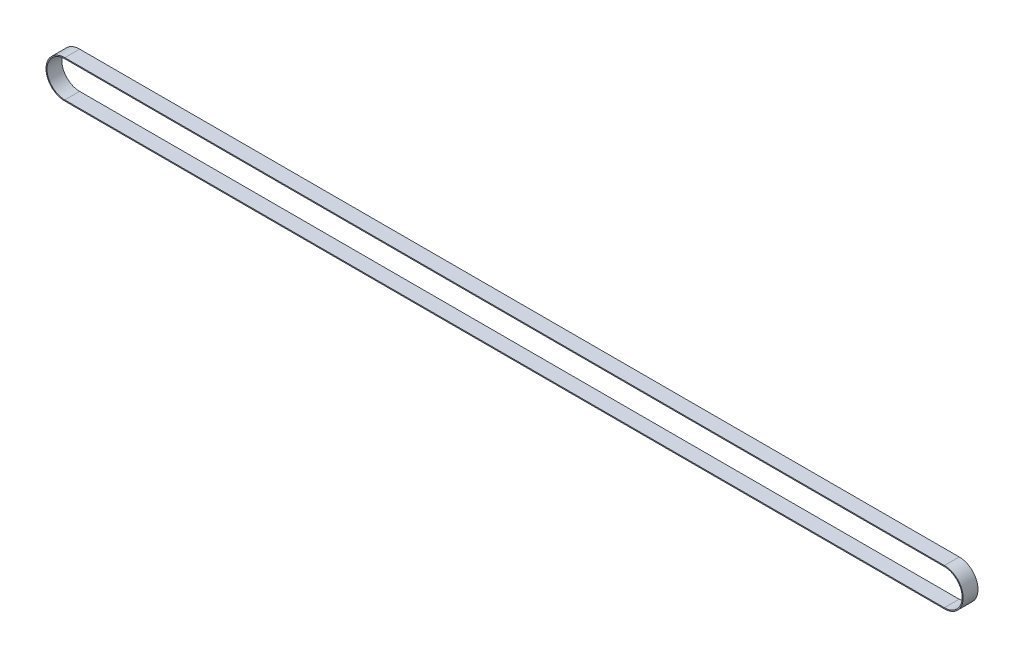
ISO-10303-21;
HEADER;
FILE_DESCRIPTION(('STEP AP214'),'2;1');
FILE_NAME('part.step','',(''),(''),'','','');
FILE_SCHEMA(('AUTOMOTIVE_DESIGN { 1 0 10303 214 1 1 1 1 }'));
ENDSEC;
DATA;
#1=APPLICATION_CONTEXT('core data for automotive mechanical design processes');
#2=APPLICATION_PROTOCOL_DEFINITION('international standard','automotive_design',2000,#1);
#3=PRODUCT_CONTEXT('',#1,'mechanical');
#4=PRODUCT('Part','Part','',(#3));
#5=PRODUCT_RELATED_PRODUCT_CATEGORY('part','',(#4));
#6=PRODUCT_DEFINITION_FORMATION('','',#4);
#7=PRODUCT_DEFINITION_CONTEXT('part definition',#1,'design');
#8=PRODUCT_DEFINITION('design','',#6,#7);
#9=PRODUCT_DEFINITION_SHAPE('','',#8);
#10=(LENGTH_UNIT() NAMED_UNIT(*) SI_UNIT(.MILLI.,.METRE.));
#11=(NAMED_UNIT(*) PLANE_ANGLE_UNIT() SI_UNIT($,.RADIAN.));
#12=(NAMED_UNIT(*) SI_UNIT($,.STERADIAN.) SOLID_ANGLE_UNIT());
#13=UNCERTAINTY_MEASURE_WITH_UNIT(LENGTH_MEASURE(1.E-05),#10,'distance_accuracy_value','');
#14=(GEOMETRIC_REPRESENTATION_CONTEXT(3) GLOBAL_UNCERTAINTY_ASSIGNED_CONTEXT((#13)) GLOBAL_UNIT_ASSIGNED_CONTEXT((#10,
#11,#12)) REPRESENTATION_CONTEXT('',''));
#15=CARTESIAN_POINT('',(0.,0.,0.));
#16=DIRECTION('',(0.,0.,1.));
#17=DIRECTION('',(1.,0.,0.));
#18=AXIS2_PLACEMENT_3D('',#15,#16,#17);
#19=CARTESIAN_POINT('',(0.,0.,15.));
#20=DIRECTION('',(0.,0.,1.));
#21=DIRECTION('',(1.,0.,0.));
#22=AXIS2_PLACEMENT_3D('',#19,#20,#21);
#23=PLANE('',#22);
#24=CARTESIAN_POINT('',(0.,0.,15.));
#25=DIRECTION('',(0.,0.,1.));
#26=DIRECTION('',(1.,0.,0.));
#27=AXIS2_PLACEMENT_3D('',#24,#25,#26);
#28=CIRCLE('',#27,19.);
#29=CARTESIAN_POINT('',(0.,19.,15.));
#30=VERTEX_POINT('',#29);
#31=CARTESIAN_POINT('',(0.,-19.,15.));
#32=VERTEX_POINT('',#31);
#33=EDGE_CURVE('E140',#30,#32,#28,.T.);
#34=ORIENTED_EDGE('',*,*,#33,.T.);
#35=DIRECTION('',(1.,0.,0.));
#36=VECTOR('',#35,1.);
#37=CARTESIAN_POINT('',(0.,-19.,15.));
#38=LINE('',#37,#36);
#39=CARTESIAN_POINT('',(889.,-19.,15.));
#40=VERTEX_POINT('',#39);
#41=EDGE_CURVE('E143',#32,#40,#38,.T.);
#42=ORIENTED_EDGE('',*,*,#41,.T.);
#43=CARTESIAN_POINT('',(889.,0.,15.));
#44=DIRECTION('',(0.,0.,1.));
#45=DIRECTION('',(1.,0.,0.));
#46=AXIS2_PLACEMENT_3D('',#43,#44,#45);
#47=CIRCLE('',#46,19.);
#48=CARTESIAN_POINT('',(889.,19.,15.));
#49=VERTEX_POINT('',#48);
#50=EDGE_CURVE('E146',#40,#49,#47,.T.);
#51=ORIENTED_EDGE('',*,*,#50,.T.);
#52=DIRECTION('',(-1.,0.,0.));
#53=VECTOR('',#52,1.);
#54=CARTESIAN_POINT('',(889.,19.,15.));
#55=LINE('',#54,#53);
#56=EDGE_CURVE('E148',#49,#30,#55,.T.);
#57=ORIENTED_EDGE('',*,*,#56,.T.);
#58=EDGE_LOOP('',(#34,#42,#51,#57));
#59=FACE_BOUND('',#58,.T.);
#60=DIRECTION('',(-1.,0.,0.));
#61=VECTOR('',#60,1.);
#62=CARTESIAN_POINT('',(889.,18.,15.));
#63=LINE('',#62,#61);
#64=CARTESIAN_POINT('',(889.,18.,15.));
#65=VERTEX_POINT('',#64);
#66=CARTESIAN_POINT('',(0.,18.,15.));
#67=VERTEX_POINT('',#66);
#68=EDGE_CURVE('E112',#65,#67,#63,.T.);
#69=ORIENTED_EDGE('',*,*,#68,.F.);
#70=CARTESIAN_POINT('',(889.,0.,15.));
#71=DIRECTION('',(0.,0.,1.));
#72=DIRECTION('',(1.,0.,0.));
#73=AXIS2_PLACEMENT_3D('',#70,#71,#72);
#74=CIRCLE('',#73,18.);
#75=CARTESIAN_POINT('',(889.,-18.,15.));
#76=VERTEX_POINT('',#75);
#77=EDGE_CURVE('E104',#76,#65,#74,.T.);
#78=ORIENTED_EDGE('',*,*,#77,.F.);
#79=DIRECTION('',(1.,0.,0.));
#80=VECTOR('',#79,1.);
#81=CARTESIAN_POINT('',(0.,-18.,15.));
#82=LINE('',#81,#80);
#83=CARTESIAN_POINT('',(0.,-18.,15.));
#84=VERTEX_POINT('',#83);
#85=EDGE_CURVE('E126',#84,#76,#82,.T.);
#86=ORIENTED_EDGE('',*,*,#85,.F.);
#87=CARTESIAN_POINT('',(0.,0.,15.));
#88=DIRECTION('',(0.,0.,1.));
#89=DIRECTION('',(1.,0.,0.));
#90=AXIS2_PLACEMENT_3D('',#87,#88,#89);
#91=CIRCLE('',#90,18.);
#92=EDGE_CURVE('E124',#67,#84,#91,.T.);
#93=ORIENTED_EDGE('',*,*,#92,.F.);
#94=EDGE_LOOP('',(#69,#78,#86,#93));
#95=FACE_BOUND('',#94,.T.);
#96=ADVANCED_FACE('F39',(#59,#95),#23,.T.);
#97=CARTESIAN_POINT('',(0.,0.,0.));
#98=DIRECTION('',(0.,0.,1.));
#99=DIRECTION('',(1.,0.,0.));
#100=AXIS2_PLACEMENT_3D('',#97,#98,#99);
#101=PLANE('',#100);
#102=CARTESIAN_POINT('',(0.,0.,0.));
#103=DIRECTION('',(0.,0.,1.));
#104=DIRECTION('',(1.,0.,0.));
#105=AXIS2_PLACEMENT_3D('',#102,#103,#104);
#106=CIRCLE('',#105,19.);
#107=CARTESIAN_POINT('',(0.,19.,0.));
#108=VERTEX_POINT('',#107);
#109=CARTESIAN_POINT('',(0.,-19.,0.));
#110=VERTEX_POINT('',#109);
#111=EDGE_CURVE('E120',#108,#110,#106,.T.);
#112=ORIENTED_EDGE('',*,*,#111,.F.);
#113=DIRECTION('',(-1.,0.,0.));
#114=VECTOR('',#113,1.);
#115=CARTESIAN_POINT('',(889.,19.,0.));
#116=LINE('',#115,#114);
#117=CARTESIAN_POINT('',(889.,19.,0.));
#118=VERTEX_POINT('',#117);
#119=EDGE_CURVE('E144',#118,#108,#116,.T.);
#120=ORIENTED_EDGE('',*,*,#119,.F.);
#121=CARTESIAN_POINT('',(889.,0.,0.));
#122=DIRECTION('',(0.,0.,1.));
#123=DIRECTION('',(1.,0.,0.));
#124=AXIS2_PLACEMENT_3D('',#121,#122,#123);
#125=CIRCLE('',#124,19.);
#126=CARTESIAN_POINT('',(889.,-19.,0.));
#127=VERTEX_POINT('',#126);
#128=EDGE_CURVE('E155',#127,#118,#125,.T.);
#129=ORIENTED_EDGE('',*,*,#128,.F.);
#130=DIRECTION('',(1.,0.,0.));
#131=VECTOR('',#130,1.);
#132=CARTESIAN_POINT('',(0.,-19.,0.));
#133=LINE('',#132,#131);
#134=EDGE_CURVE('E153',#110,#127,#133,.T.);
#135=ORIENTED_EDGE('',*,*,#134,.F.);
#136=EDGE_LOOP('',(#112,#120,#129,#135));
#137=FACE_BOUND('',#136,.T.);
#138=CARTESIAN_POINT('',(889.,0.,0.));
#139=DIRECTION('',(0.,0.,1.));
#140=DIRECTION('',(1.,0.,0.));
#141=AXIS2_PLACEMENT_3D('',#138,#139,#140);
#142=CIRCLE('',#141,18.);
#143=CARTESIAN_POINT('',(889.,-18.,0.));
#144=VERTEX_POINT('',#143);
#145=CARTESIAN_POINT('',(889.,18.,0.));
#146=VERTEX_POINT('',#145);
#147=EDGE_CURVE('E62',#144,#146,#142,.T.);
#148=ORIENTED_EDGE('',*,*,#147,.T.);
#149=DIRECTION('',(-1.,0.,0.));
#150=VECTOR('',#149,1.);
#151=CARTESIAN_POINT('',(889.,18.,0.));
#152=LINE('',#151,#150);
#153=CARTESIAN_POINT('',(0.,18.,0.));
#154=VERTEX_POINT('',#153);
#155=EDGE_CURVE('E119',#146,#154,#152,.T.);
#156=ORIENTED_EDGE('',*,*,#155,.T.);
#157=CARTESIAN_POINT('',(0.,0.,0.));
#158=DIRECTION('',(0.,0.,1.));
#159=DIRECTION('',(1.,0.,0.));
#160=AXIS2_PLACEMENT_3D('',#157,#158,#159);
#161=CIRCLE('',#160,18.);
#162=CARTESIAN_POINT('',(0.,-18.,0.));
#163=VERTEX_POINT('',#162);
#164=EDGE_CURVE('E132',#154,#163,#161,.T.);
#165=ORIENTED_EDGE('',*,*,#164,.T.);
#166=DIRECTION('',(1.,0.,0.));
#167=VECTOR('',#166,1.);
#168=CARTESIAN_POINT('',(0.,-18.,0.));
#169=LINE('',#168,#167);
#170=EDGE_CURVE('E113',#163,#144,#169,.T.);
#171=ORIENTED_EDGE('',*,*,#170,.T.);
#172=EDGE_LOOP('',(#148,#156,#165,#171));
#173=FACE_BOUND('',#172,.T.);
#174=ADVANCED_FACE('F173',(#137,#173),#101,.F.);
#175=CARTESIAN_POINT('',(0.,0.,15.));
#176=DIRECTION('',(0.,0.,-1.));
#177=DIRECTION('',(-1.,0.,0.));
#178=AXIS2_PLACEMENT_3D('',#175,#176,#177);
#179=CYLINDRICAL_SURFACE('',#178,19.);
#180=ORIENTED_EDGE('',*,*,#111,.T.);
#181=DIRECTION('',(0.,0.,-1.));
#182=VECTOR('',#181,1.);
#183=CARTESIAN_POINT('',(0.,-19.,15.));
#184=LINE('',#183,#182);
#185=EDGE_CURVE('E11',#32,#110,#184,.T.);
#186=ORIENTED_EDGE('',*,*,#185,.F.);
#187=ORIENTED_EDGE('',*,*,#33,.F.);
#188=DIRECTION('',(0.,0.,-1.));
#189=VECTOR('',#188,1.);
#190=CARTESIAN_POINT('',(0.,19.,15.));
#191=LINE('',#190,#189);
#192=EDGE_CURVE('E150',#30,#108,#191,.T.);
#193=ORIENTED_EDGE('',*,*,#192,.T.);
#194=EDGE_LOOP('',(#180,#186,#187,#193));
#195=FACE_BOUND('',#194,.T.);
#196=ADVANCED_FACE('F41',(#195),#179,.T.);
#197=CARTESIAN_POINT('',(0.,-19.,15.));
#198=DIRECTION('',(0.,1.,0.));
#199=DIRECTION('',(-1.,0.,0.));
#200=AXIS2_PLACEMENT_3D('',#197,#198,#199);
#201=PLANE('',#200);
#202=ORIENTED_EDGE('',*,*,#134,.T.);
#203=DIRECTION('',(0.,0.,-1.));
#204=VECTOR('',#203,1.);
#205=CARTESIAN_POINT('',(889.,-19.,15.));
#206=LINE('',#205,#204);
#207=EDGE_CURVE('E47',#40,#127,#206,.T.);
#208=ORIENTED_EDGE('',*,*,#207,.F.);
#209=ORIENTED_EDGE('',*,*,#41,.F.);
#210=ORIENTED_EDGE('',*,*,#185,.T.);
#211=EDGE_LOOP('',(#202,#208,#209,#210));
#212=FACE_BOUND('',#211,.T.);
#213=ADVANCED_FACE('F183',(#212),#201,.F.);
#214=CARTESIAN_POINT('',(889.,0.,15.));
#215=DIRECTION('',(0.,0.,-1.));
#216=DIRECTION('',(-1.,0.,0.));
#217=AXIS2_PLACEMENT_3D('',#214,#215,#216);
#218=CYLINDRICAL_SURFACE('',#217,19.);
#219=ORIENTED_EDGE('',*,*,#128,.T.);
#220=DIRECTION('',(0.,0.,-1.));
#221=VECTOR('',#220,1.);
#222=CARTESIAN_POINT('',(889.,19.,15.));
#223=LINE('',#222,#221);
#224=EDGE_CURVE('E160',#49,#118,#223,.T.);
#225=ORIENTED_EDGE('',*,*,#224,.F.);
#226=ORIENTED_EDGE('',*,*,#50,.F.);
#227=ORIENTED_EDGE('',*,*,#207,.T.);
#228=EDGE_LOOP('',(#219,#225,#226,#227));
#229=FACE_BOUND('',#228,.T.);
#230=ADVANCED_FACE('F167',(#229),#218,.T.);
#231=CARTESIAN_POINT('',(889.,19.,15.));
#232=DIRECTION('',(0.,-1.,0.));
#233=DIRECTION('',(1.,0.,0.));
#234=AXIS2_PLACEMENT_3D('',#231,#232,#233);
#235=PLANE('',#234);
#236=ORIENTED_EDGE('',*,*,#119,.T.);
#237=ORIENTED_EDGE('',*,*,#192,.F.);
#238=ORIENTED_EDGE('',*,*,#56,.F.);
#239=ORIENTED_EDGE('',*,*,#224,.T.);
#240=EDGE_LOOP('',(#236,#237,#238,#239));
#241=FACE_BOUND('',#240,.T.);
#242=ADVANCED_FACE('F177',(#241),#235,.F.);
#243=CARTESIAN_POINT('',(889.,0.,15.));
#244=DIRECTION('',(0.,0.,-1.));
#245=DIRECTION('',(-1.,0.,0.));
#246=AXIS2_PLACEMENT_3D('',#243,#244,#245);
#247=CYLINDRICAL_SURFACE('',#246,18.);
#248=ORIENTED_EDGE('',*,*,#147,.F.);
#249=DIRECTION('',(0.,0.,-1.));
#250=VECTOR('',#249,1.);
#251=CARTESIAN_POINT('',(889.,-18.,15.));
#252=LINE('',#251,#250);
#253=EDGE_CURVE('E108',#76,#144,#252,.T.);
#254=ORIENTED_EDGE('',*,*,#253,.F.);
#255=ORIENTED_EDGE('',*,*,#77,.T.);
#256=DIRECTION('',(0.,0.,-1.));
#257=VECTOR('',#256,1.);
#258=CARTESIAN_POINT('',(889.,18.,15.));
#259=LINE('',#258,#257);
#260=EDGE_CURVE('E107',#65,#146,#259,.T.);
#261=ORIENTED_EDGE('',*,*,#260,.T.);
#262=EDGE_LOOP('',(#248,#254,#255,#261));
#263=FACE_BOUND('',#262,.T.);
#264=ADVANCED_FACE('F106',(#263),#247,.F.);
#265=CARTESIAN_POINT('',(889.,18.,15.));
#266=DIRECTION('',(0.,-1.,0.));
#267=DIRECTION('',(1.,0.,0.));
#268=AXIS2_PLACEMENT_3D('',#265,#266,#267);
#269=PLANE('',#268);
#270=ORIENTED_EDGE('',*,*,#155,.F.);
#271=ORIENTED_EDGE('',*,*,#260,.F.);
#272=ORIENTED_EDGE('',*,*,#68,.T.);
#273=DIRECTION('',(0.,0.,-1.));
#274=VECTOR('',#273,1.);
#275=CARTESIAN_POINT('',(0.,18.,15.));
#276=LINE('',#275,#274);
#277=EDGE_CURVE('E121',#67,#154,#276,.T.);
#278=ORIENTED_EDGE('',*,*,#277,.T.);
#279=EDGE_LOOP('',(#270,#271,#272,#278));
#280=FACE_BOUND('',#279,.T.);
#281=ADVANCED_FACE('F116',(#280),#269,.T.);
#282=CARTESIAN_POINT('',(0.,0.,15.));
#283=DIRECTION('',(0.,0.,-1.));
#284=DIRECTION('',(-1.,0.,0.));
#285=AXIS2_PLACEMENT_3D('',#282,#283,#284);
#286=CYLINDRICAL_SURFACE('',#285,18.);
#287=ORIENTED_EDGE('',*,*,#164,.F.);
#288=ORIENTED_EDGE('',*,*,#277,.F.);
#289=ORIENTED_EDGE('',*,*,#92,.T.);
#290=DIRECTION('',(0.,0.,-1.));
#291=VECTOR('',#290,1.);
#292=CARTESIAN_POINT('',(0.,-18.,15.));
#293=LINE('',#292,#291);
#294=EDGE_CURVE('E54',#84,#163,#293,.T.);
#295=ORIENTED_EDGE('',*,*,#294,.T.);
#296=EDGE_LOOP('',(#287,#288,#289,#295));
#297=FACE_BOUND('',#296,.T.);
#298=ADVANCED_FACE('F206',(#297),#286,.F.);
#299=CARTESIAN_POINT('',(0.,-18.,15.));
#300=DIRECTION('',(0.,1.,0.));
#301=DIRECTION('',(-1.,0.,0.));
#302=AXIS2_PLACEMENT_3D('',#299,#300,#301);
#303=PLANE('',#302);
#304=ORIENTED_EDGE('',*,*,#170,.F.);
#305=ORIENTED_EDGE('',*,*,#294,.F.);
#306=ORIENTED_EDGE('',*,*,#85,.T.);
#307=ORIENTED_EDGE('',*,*,#253,.T.);
#308=EDGE_LOOP('',(#304,#305,#306,#307));
#309=FACE_BOUND('',#308,.T.);
#310=ADVANCED_FACE('F210',(#309),#303,.T.);
#311=CLOSED_SHELL('',(#96,#174,#196,#213,#230,#242,#264,#281,#298,#310));
#312=MANIFOLD_SOLID_BREP('B2',#311);
#313=ADVANCED_BREP_SHAPE_REPRESENTATION('',(#18,#312),#14);
#314=SHAPE_DEFINITION_REPRESENTATION(#9,#313);
ENDSEC;
END-ISO-10303-21;
